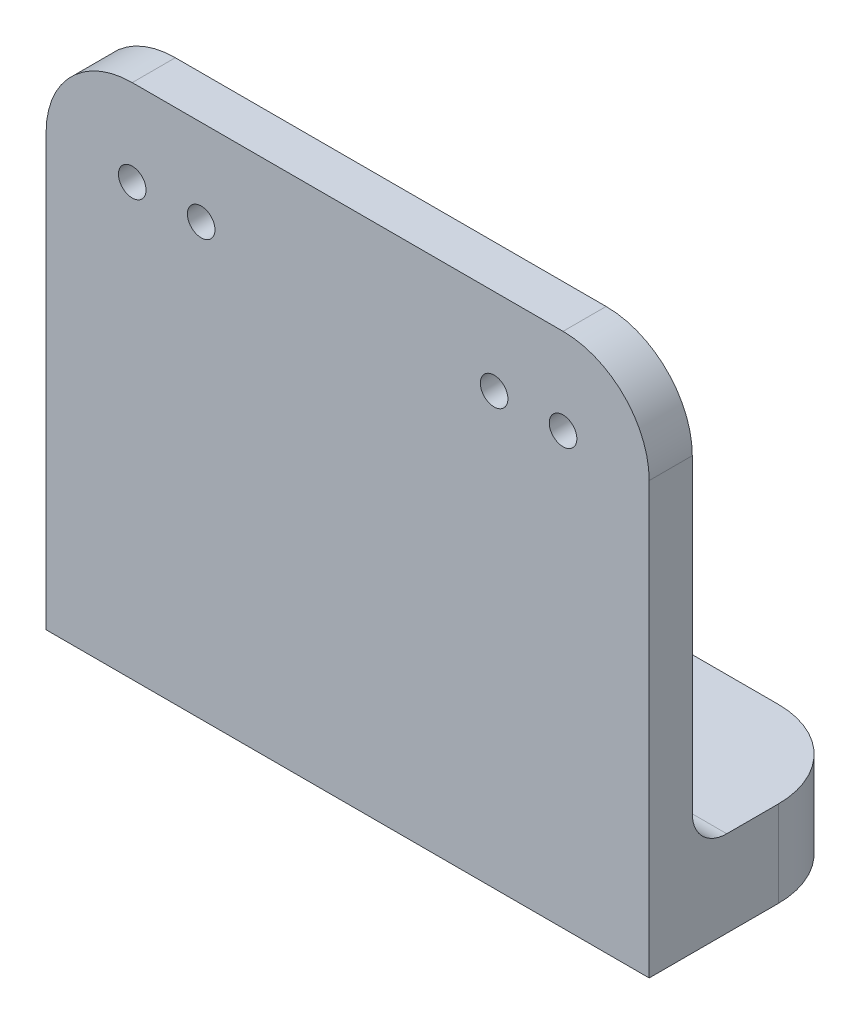
ISO-10303-21;
HEADER;
FILE_DESCRIPTION(('STEP AP214'),'2;1');
FILE_NAME('part.step','',(''),(''),'','','');
FILE_SCHEMA(('AUTOMOTIVE_DESIGN { 1 0 10303 214 1 1 1 1 }'));
ENDSEC;
DATA;
#1=APPLICATION_CONTEXT('core data for automotive mechanical design processes');
#2=APPLICATION_PROTOCOL_DEFINITION('international standard','automotive_design',2000,#1);
#3=PRODUCT_CONTEXT('',#1,'mechanical');
#4=PRODUCT('Part','Part','',(#3));
#5=PRODUCT_RELATED_PRODUCT_CATEGORY('part','',(#4));
#6=PRODUCT_DEFINITION_FORMATION('','',#4);
#7=PRODUCT_DEFINITION_CONTEXT('part definition',#1,'design');
#8=PRODUCT_DEFINITION('design','',#6,#7);
#9=PRODUCT_DEFINITION_SHAPE('','',#8);
#10=(LENGTH_UNIT() NAMED_UNIT(*) SI_UNIT(.MILLI.,.METRE.));
#11=(NAMED_UNIT(*) PLANE_ANGLE_UNIT() SI_UNIT($,.RADIAN.));
#12=(NAMED_UNIT(*) SI_UNIT($,.STERADIAN.) SOLID_ANGLE_UNIT());
#13=UNCERTAINTY_MEASURE_WITH_UNIT(LENGTH_MEASURE(1.E-05),#10,'distance_accuracy_value','');
#14=(GEOMETRIC_REPRESENTATION_CONTEXT(3) GLOBAL_UNCERTAINTY_ASSIGNED_CONTEXT((#13)) GLOBAL_UNIT_ASSIGNED_CONTEXT((#10,
#11,#12)) REPRESENTATION_CONTEXT('',''));
#15=CARTESIAN_POINT('',(0.,0.,0.));
#16=DIRECTION('',(0.,0.,1.));
#17=DIRECTION('',(1.,0.,0.));
#18=AXIS2_PLACEMENT_3D('',#15,#16,#17);
#19=CARTESIAN_POINT('',(20.,10.,-15.));
#20=DIRECTION('',(0.,-1.,0.));
#21=DIRECTION('',(0.,0.,-1.));
#22=AXIS2_PLACEMENT_3D('',#19,#20,#21);
#23=CYLINDRICAL_SURFACE('',#22,1.6);
#24=CARTESIAN_POINT('',(20.,0.,-15.));
#25=DIRECTION('',(0.,1.,0.));
#26=DIRECTION('',(0.,0.,1.));
#27=AXIS2_PLACEMENT_3D('',#24,#25,#26);
#28=CIRCLE('',#27,1.6);
#29=CARTESIAN_POINT('',(20.,0.,-13.4));
#30=VERTEX_POINT('',#29);
#31=EDGE_CURVE('E141',#30,#30,#28,.T.);
#32=ORIENTED_EDGE('',*,*,#31,.F.);
#33=EDGE_LOOP('',(#32));
#34=FACE_BOUND('',#33,.T.);
#35=CARTESIAN_POINT('',(20.,5.,-15.));
#36=DIRECTION('',(0.,1.,0.));
#37=DIRECTION('',(0.,0.,1.));
#38=AXIS2_PLACEMENT_3D('',#35,#36,#37);
#39=CIRCLE('',#38,1.6);
#40=CARTESIAN_POINT('',(20.,5.,-13.4));
#41=VERTEX_POINT('',#40);
#42=EDGE_CURVE('E176',#41,#41,#39,.T.);
#43=ORIENTED_EDGE('',*,*,#42,.T.);
#44=EDGE_LOOP('',(#43));
#45=FACE_BOUND('',#44,.T.);
#46=ADVANCED_FACE('F42',(#34,#45),#23,.F.);
#47=CARTESIAN_POINT('',(50.,10.,-15.));
#48=DIRECTION('',(0.,-1.,0.));
#49=DIRECTION('',(0.,0.,-1.));
#50=AXIS2_PLACEMENT_3D('',#47,#48,#49);
#51=CYLINDRICAL_SURFACE('',#50,1.6);
#52=CARTESIAN_POINT('',(50.,0.,-15.));
#53=DIRECTION('',(0.,1.,0.));
#54=DIRECTION('',(0.,0.,1.));
#55=AXIS2_PLACEMENT_3D('',#52,#53,#54);
#56=CIRCLE('',#55,1.6);
#57=CARTESIAN_POINT('',(50.,0.,-13.4));
#58=VERTEX_POINT('',#57);
#59=EDGE_CURVE('E283',#58,#58,#56,.T.);
#60=ORIENTED_EDGE('',*,*,#59,.F.);
#61=EDGE_LOOP('',(#60));
#62=FACE_BOUND('',#61,.T.);
#63=CARTESIAN_POINT('',(50.,5.,-15.));
#64=DIRECTION('',(0.,1.,0.));
#65=DIRECTION('',(0.,0.,1.));
#66=AXIS2_PLACEMENT_3D('',#63,#64,#65);
#67=CIRCLE('',#66,1.6);
#68=CARTESIAN_POINT('',(50.,5.,-13.4));
#69=VERTEX_POINT('',#68);
#70=EDGE_CURVE('E172',#69,#69,#67,.T.);
#71=ORIENTED_EDGE('',*,*,#70,.T.);
#72=EDGE_LOOP('',(#71));
#73=FACE_BOUND('',#72,.T.);
#74=ADVANCED_FACE('F341',(#62,#73),#51,.F.);
#75=CARTESIAN_POINT('',(0.,10.,0.));
#76=DIRECTION('',(0.,-1.,0.));
#77=DIRECTION('',(0.,0.,-1.));
#78=AXIS2_PLACEMENT_3D('',#75,#76,#77);
#79=PLANE('',#78);
#80=CARTESIAN_POINT('',(20.,10.,-15.));
#81=DIRECTION('',(0.,1.,0.));
#82=DIRECTION('',(0.,0.,1.));
#83=AXIS2_PLACEMENT_3D('',#80,#81,#82);
#84=CIRCLE('',#83,3.5);
#85=CARTESIAN_POINT('',(20.,10.,-11.5));
#86=VERTEX_POINT('',#85);
#87=EDGE_CURVE('E266',#86,#86,#84,.T.);
#88=ORIENTED_EDGE('',*,*,#87,.F.);
#89=EDGE_LOOP('',(#88));
#90=FACE_BOUND('',#89,.T.);
#91=CARTESIAN_POINT('',(50.,10.,-15.));
#92=DIRECTION('',(0.,1.,0.));
#93=DIRECTION('',(0.,0.,1.));
#94=AXIS2_PLACEMENT_3D('',#91,#92,#93);
#95=CIRCLE('',#94,3.50000000000001);
#96=CARTESIAN_POINT('',(50.,10.,-11.5));
#97=VERTEX_POINT('',#96);
#98=EDGE_CURVE('E260',#97,#97,#95,.T.);
#99=ORIENTED_EDGE('',*,*,#98,.F.);
#100=EDGE_LOOP('',(#99));
#101=FACE_BOUND('',#100,.T.);
#102=DIRECTION('',(0.,0.,-1.));
#103=VECTOR('',#102,1.);
#104=CARTESIAN_POINT('',(70.,10.,0.));
#105=LINE('',#104,#103);
#106=CARTESIAN_POINT('',(70.,10.,-9.));
#107=VERTEX_POINT('',#106);
#108=CARTESIAN_POINT('',(70.,10.,-15.));
#109=VERTEX_POINT('',#108);
#110=EDGE_CURVE('E292',#107,#109,#105,.T.);
#111=ORIENTED_EDGE('',*,*,#110,.T.);
#112=CARTESIAN_POINT('',(60.,10.,-15.));
#113=DIRECTION('',(0.,-1.,0.));
#114=DIRECTION('',(0.,0.,-1.));
#115=AXIS2_PLACEMENT_3D('',#112,#113,#114);
#116=CIRCLE('',#115,10.);
#117=CARTESIAN_POINT('',(60.,10.,-25.));
#118=VERTEX_POINT('',#117);
#119=EDGE_CURVE('E11',#109,#118,#116,.F.);
#120=ORIENTED_EDGE('',*,*,#119,.T.);
#121=DIRECTION('',(-1.,0.,0.));
#122=VECTOR('',#121,1.);
#123=CARTESIAN_POINT('',(0.,10.,-25.));
#124=LINE('',#123,#122);
#125=CARTESIAN_POINT('',(10.,10.,-25.));
#126=VERTEX_POINT('',#125);
#127=EDGE_CURVE('E170',#118,#126,#124,.T.);
#128=ORIENTED_EDGE('',*,*,#127,.T.);
#129=CARTESIAN_POINT('',(10.,10.,-15.));
#130=DIRECTION('',(0.,-1.,0.));
#131=DIRECTION('',(0.,0.,-1.));
#132=AXIS2_PLACEMENT_3D('',#129,#130,#131);
#133=CIRCLE('',#132,10.);
#134=CARTESIAN_POINT('',(0.,10.,-15.));
#135=VERTEX_POINT('',#134);
#136=EDGE_CURVE('E52',#126,#135,#133,.F.);
#137=ORIENTED_EDGE('',*,*,#136,.T.);
#138=DIRECTION('',(0.,0.,1.));
#139=VECTOR('',#138,1.);
#140=CARTESIAN_POINT('',(0.,10.,0.));
#141=LINE('',#140,#139);
#142=CARTESIAN_POINT('',(0.,10.,-9.));
#143=VERTEX_POINT('',#142);
#144=EDGE_CURVE('E168',#135,#143,#141,.T.);
#145=ORIENTED_EDGE('',*,*,#144,.T.);
#146=DIRECTION('',(-1.,0.,0.));
#147=VECTOR('',#146,1.);
#148=CARTESIAN_POINT('',(70.,10.,-9.));
#149=LINE('',#148,#147);
#150=EDGE_CURVE('E185',#143,#107,#149,.F.);
#151=ORIENTED_EDGE('',*,*,#150,.T.);
#152=EDGE_LOOP('',(#111,#120,#128,#137,#145,#151));
#153=FACE_BOUND('',#152,.T.);
#154=ADVANCED_FACE('F296',(#90,#101,#153),#79,.F.);
#155=CARTESIAN_POINT('',(0.,0.,0.));
#156=DIRECTION('',(0.,-1.,0.));
#157=DIRECTION('',(0.,0.,-1.));
#158=AXIS2_PLACEMENT_3D('',#155,#156,#157);
#159=PLANE('',#158);
#160=ORIENTED_EDGE('',*,*,#31,.T.);
#161=EDGE_LOOP('',(#160));
#162=FACE_BOUND('',#161,.T.);
#163=DIRECTION('',(-1.,0.,0.));
#164=VECTOR('',#163,1.);
#165=CARTESIAN_POINT('',(0.,0.,-25.));
#166=LINE('',#165,#164);
#167=CARTESIAN_POINT('',(60.,0.,-25.));
#168=VERTEX_POINT('',#167);
#169=CARTESIAN_POINT('',(10.,0.,-25.));
#170=VERTEX_POINT('',#169);
#171=EDGE_CURVE('E162',#168,#170,#166,.T.);
#172=ORIENTED_EDGE('',*,*,#171,.F.);
#173=CARTESIAN_POINT('',(60.,0.,-15.));
#174=DIRECTION('',(0.,-1.,0.));
#175=DIRECTION('',(0.,0.,-1.));
#176=AXIS2_PLACEMENT_3D('',#173,#174,#175);
#177=CIRCLE('',#176,10.);
#178=CARTESIAN_POINT('',(70.,0.,-15.));
#179=VERTEX_POINT('',#178);
#180=EDGE_CURVE('E235',#168,#179,#177,.T.);
#181=ORIENTED_EDGE('',*,*,#180,.T.);
#182=DIRECTION('',(0.,0.,-1.));
#183=VECTOR('',#182,1.);
#184=CARTESIAN_POINT('',(70.,0.,0.));
#185=LINE('',#184,#183);
#186=CARTESIAN_POINT('',(70.,0.,0.));
#187=VERTEX_POINT('',#186);
#188=EDGE_CURVE('E158',#187,#179,#185,.T.);
#189=ORIENTED_EDGE('',*,*,#188,.F.);
#190=DIRECTION('',(1.,0.,0.));
#191=VECTOR('',#190,1.);
#192=CARTESIAN_POINT('',(0.,0.,0.));
#193=LINE('',#192,#191);
#194=CARTESIAN_POINT('',(0.,0.,0.));
#195=VERTEX_POINT('',#194);
#196=EDGE_CURVE('E140',#195,#187,#193,.T.);
#197=ORIENTED_EDGE('',*,*,#196,.F.);
#198=DIRECTION('',(0.,0.,1.));
#199=VECTOR('',#198,1.);
#200=CARTESIAN_POINT('',(0.,0.,0.));
#201=LINE('',#200,#199);
#202=CARTESIAN_POINT('',(0.,0.,-15.));
#203=VERTEX_POINT('',#202);
#204=EDGE_CURVE('E129',#203,#195,#201,.T.);
#205=ORIENTED_EDGE('',*,*,#204,.F.);
#206=CARTESIAN_POINT('',(10.,0.,-15.));
#207=DIRECTION('',(0.,-1.,0.));
#208=DIRECTION('',(0.,0.,-1.));
#209=AXIS2_PLACEMENT_3D('',#206,#207,#208);
#210=CIRCLE('',#209,10.);
#211=EDGE_CURVE('E232',#203,#170,#210,.T.);
#212=ORIENTED_EDGE('',*,*,#211,.T.);
#213=EDGE_LOOP('',(#172,#181,#189,#197,#205,#212));
#214=FACE_BOUND('',#213,.T.);
#215=ORIENTED_EDGE('',*,*,#59,.T.);
#216=EDGE_LOOP('',(#215));
#217=FACE_BOUND('',#216,.T.);
#218=ADVANCED_FACE('F155',(#162,#214,#217),#159,.T.);
#219=CARTESIAN_POINT('',(0.,10.,0.));
#220=DIRECTION('',(1.,0.,0.));
#221=DIRECTION('',(0.,0.,-1.));
#222=AXIS2_PLACEMENT_3D('',#219,#220,#221);
#223=PLANE('',#222);
#224=DIRECTION('',(0.,-1.,0.));
#225=VECTOR('',#224,1.);
#226=CARTESIAN_POINT('',(0.,10.,0.));
#227=LINE('',#226,#225);
#228=CARTESIAN_POINT('',(0.,50.,0.));
#229=VERTEX_POINT('',#228);
#230=EDGE_CURVE('E132',#229,#195,#227,.T.);
#231=ORIENTED_EDGE('',*,*,#230,.F.);
#232=DIRECTION('',(0.,0.,1.));
#233=VECTOR('',#232,1.);
#234=CARTESIAN_POINT('',(0.,50.,0.));
#235=LINE('',#234,#233);
#236=CARTESIAN_POINT('',(0.,50.,-5.));
#237=VERTEX_POINT('',#236);
#238=EDGE_CURVE('E211',#229,#237,#235,.F.);
#239=ORIENTED_EDGE('',*,*,#238,.T.);
#240=DIRECTION('',(0.,-1.,0.));
#241=VECTOR('',#240,1.);
#242=CARTESIAN_POINT('',(0.,60.,-5.));
#243=LINE('',#242,#241);
#244=CARTESIAN_POINT('',(0.,14.,-5.));
#245=VERTEX_POINT('',#244);
#246=EDGE_CURVE('E277',#237,#245,#243,.T.);
#247=ORIENTED_EDGE('',*,*,#246,.T.);
#248=CARTESIAN_POINT('',(0.,14.,-9.));
#249=DIRECTION('',(1.,0.,0.));
#250=DIRECTION('',(0.,0.,-1.));
#251=AXIS2_PLACEMENT_3D('',#248,#249,#250);
#252=CIRCLE('',#251,4.);
#253=EDGE_CURVE('E188',#245,#143,#252,.T.);
#254=ORIENTED_EDGE('',*,*,#253,.T.);
#255=ORIENTED_EDGE('',*,*,#144,.F.);
#256=DIRECTION('',(0.,-1.,0.));
#257=VECTOR('',#256,1.);
#258=CARTESIAN_POINT('',(0.,10.,-15.));
#259=LINE('',#258,#257);
#260=EDGE_CURVE('E136',#135,#203,#259,.T.);
#261=ORIENTED_EDGE('',*,*,#260,.T.);
#262=ORIENTED_EDGE('',*,*,#204,.T.);
#263=EDGE_LOOP('',(#231,#239,#247,#254,#255,#261,#262));
#264=FACE_BOUND('',#263,.T.);
#265=ADVANCED_FACE('F131',(#264),#223,.F.);
#266=CARTESIAN_POINT('',(0.,10.,0.));
#267=DIRECTION('',(0.,0.,-1.));
#268=DIRECTION('',(-1.,0.,0.));
#269=AXIS2_PLACEMENT_3D('',#266,#267,#268);
#270=PLANE('',#269);
#271=CARTESIAN_POINT('',(10.,50.,0.));
#272=DIRECTION('',(0.,0.,1.));
#273=DIRECTION('',(1.,0.,0.));
#274=AXIS2_PLACEMENT_3D('',#271,#272,#273);
#275=CIRCLE('',#274,1.6);
#276=CARTESIAN_POINT('',(11.6,50.,0.));
#277=VERTEX_POINT('',#276);
#278=EDGE_CURVE('E245',#277,#277,#275,.T.);
#279=ORIENTED_EDGE('',*,*,#278,.F.);
#280=EDGE_LOOP('',(#279));
#281=FACE_BOUND('',#280,.T.);
#282=CARTESIAN_POINT('',(18.,50.,0.));
#283=DIRECTION('',(0.,0.,1.));
#284=DIRECTION('',(1.,0.,0.));
#285=AXIS2_PLACEMENT_3D('',#282,#283,#284);
#286=CIRCLE('',#285,1.6);
#287=CARTESIAN_POINT('',(19.6,50.,0.));
#288=VERTEX_POINT('',#287);
#289=EDGE_CURVE('E587',#288,#288,#286,.T.);
#290=ORIENTED_EDGE('',*,*,#289,.F.);
#291=EDGE_LOOP('',(#290));
#292=FACE_BOUND('',#291,.T.);
#293=CARTESIAN_POINT('',(52.,50.,0.));
#294=DIRECTION('',(0.,0.,1.));
#295=DIRECTION('',(-1.,0.,0.));
#296=AXIS2_PLACEMENT_3D('',#293,#294,#295);
#297=CIRCLE('',#296,1.6);
#298=CARTESIAN_POINT('',(50.4,50.,0.));
#299=VERTEX_POINT('',#298);
#300=EDGE_CURVE('E591',#299,#299,#297,.T.);
#301=ORIENTED_EDGE('',*,*,#300,.F.);
#302=EDGE_LOOP('',(#301));
#303=FACE_BOUND('',#302,.T.);
#304=CARTESIAN_POINT('',(60.,50.,0.));
#305=DIRECTION('',(0.,0.,1.));
#306=DIRECTION('',(-1.,0.,0.));
#307=AXIS2_PLACEMENT_3D('',#304,#305,#306);
#308=CIRCLE('',#307,1.6);
#309=CARTESIAN_POINT('',(58.4,50.,0.));
#310=VERTEX_POINT('',#309);
#311=EDGE_CURVE('E597',#310,#310,#308,.T.);
#312=ORIENTED_EDGE('',*,*,#311,.F.);
#313=EDGE_LOOP('',(#312));
#314=FACE_BOUND('',#313,.T.);
#315=DIRECTION('',(1.,0.,0.));
#316=VECTOR('',#315,1.);
#317=CARTESIAN_POINT('',(0.,60.,0.));
#318=LINE('',#317,#316);
#319=CARTESIAN_POINT('',(10.,60.,0.));
#320=VERTEX_POINT('',#319);
#321=CARTESIAN_POINT('',(60.,60.,0.));
#322=VERTEX_POINT('',#321);
#323=EDGE_CURVE('E181',#320,#322,#318,.T.);
#324=ORIENTED_EDGE('',*,*,#323,.F.);
#325=CARTESIAN_POINT('',(10.,50.,0.));
#326=DIRECTION('',(0.,0.,-1.));
#327=DIRECTION('',(-1.,0.,0.));
#328=AXIS2_PLACEMENT_3D('',#325,#326,#327);
#329=CIRCLE('',#328,10.);
#330=EDGE_CURVE('E149',#320,#229,#329,.F.);
#331=ORIENTED_EDGE('',*,*,#330,.T.);
#332=ORIENTED_EDGE('',*,*,#230,.T.);
#333=ORIENTED_EDGE('',*,*,#196,.T.);
#334=DIRECTION('',(0.,-1.,0.));
#335=VECTOR('',#334,1.);
#336=CARTESIAN_POINT('',(70.,10.,0.));
#337=LINE('',#336,#335);
#338=CARTESIAN_POINT('',(70.,50.,0.));
#339=VERTEX_POINT('',#338);
#340=EDGE_CURVE('E152',#339,#187,#337,.T.);
#341=ORIENTED_EDGE('',*,*,#340,.F.);
#342=CARTESIAN_POINT('',(60.,50.,0.));
#343=DIRECTION('',(0.,0.,-1.));
#344=DIRECTION('',(-1.,0.,0.));
#345=AXIS2_PLACEMENT_3D('',#342,#343,#344);
#346=CIRCLE('',#345,10.);
#347=EDGE_CURVE('E204',#339,#322,#346,.F.);
#348=ORIENTED_EDGE('',*,*,#347,.T.);
#349=EDGE_LOOP('',(#324,#331,#332,#333,#341,#348));
#350=FACE_BOUND('',#349,.T.);
#351=ADVANCED_FACE('F146',(#281,#292,#303,#314,#350),#270,.F.);
#352=CARTESIAN_POINT('',(70.,10.,0.));
#353=DIRECTION('',(-1.,0.,0.));
#354=DIRECTION('',(0.,0.,1.));
#355=AXIS2_PLACEMENT_3D('',#352,#353,#354);
#356=PLANE('',#355);
#357=DIRECTION('',(0.,-1.,0.));
#358=VECTOR('',#357,1.);
#359=CARTESIAN_POINT('',(70.,60.,-5.));
#360=LINE('',#359,#358);
#361=CARTESIAN_POINT('',(70.,50.,-5.));
#362=VERTEX_POINT('',#361);
#363=CARTESIAN_POINT('',(70.,14.,-5.));
#364=VERTEX_POINT('',#363);
#365=EDGE_CURVE('E280',#362,#364,#360,.T.);
#366=ORIENTED_EDGE('',*,*,#365,.F.);
#367=DIRECTION('',(0.,0.,-1.));
#368=VECTOR('',#367,1.);
#369=CARTESIAN_POINT('',(70.,50.,0.));
#370=LINE('',#369,#368);
#371=EDGE_CURVE('E223',#362,#339,#370,.F.);
#372=ORIENTED_EDGE('',*,*,#371,.T.);
#373=ORIENTED_EDGE('',*,*,#340,.T.);
#374=ORIENTED_EDGE('',*,*,#188,.T.);
#375=DIRECTION('',(0.,-1.,0.));
#376=VECTOR('',#375,1.);
#377=CARTESIAN_POINT('',(70.,10.,-15.));
#378=LINE('',#377,#376);
#379=EDGE_CURVE('E220',#179,#109,#378,.F.);
#380=ORIENTED_EDGE('',*,*,#379,.T.);
#381=ORIENTED_EDGE('',*,*,#110,.F.);
#382=CARTESIAN_POINT('',(70.,14.,-9.));
#383=DIRECTION('',(-1.,0.,0.));
#384=DIRECTION('',(0.,0.,1.));
#385=AXIS2_PLACEMENT_3D('',#382,#383,#384);
#386=CIRCLE('',#385,4.);
#387=EDGE_CURVE('E192',#107,#364,#386,.T.);
#388=ORIENTED_EDGE('',*,*,#387,.T.);
#389=EDGE_LOOP('',(#366,#372,#373,#374,#380,#381,#388));
#390=FACE_BOUND('',#389,.T.);
#391=ADVANCED_FACE('F305',(#390),#356,.F.);
#392=CARTESIAN_POINT('',(0.,10.,-25.));
#393=DIRECTION('',(0.,0.,1.));
#394=DIRECTION('',(1.,0.,0.));
#395=AXIS2_PLACEMENT_3D('',#392,#393,#394);
#396=PLANE('',#395);
#397=ORIENTED_EDGE('',*,*,#127,.F.);
#398=DIRECTION('',(0.,-1.,0.));
#399=VECTOR('',#398,1.);
#400=CARTESIAN_POINT('',(60.,10.,-25.));
#401=LINE('',#400,#399);
#402=EDGE_CURVE('E228',#118,#168,#401,.T.);
#403=ORIENTED_EDGE('',*,*,#402,.T.);
#404=ORIENTED_EDGE('',*,*,#171,.T.);
#405=DIRECTION('',(0.,-1.,0.));
#406=VECTOR('',#405,1.);
#407=CARTESIAN_POINT('',(10.,10.,-25.));
#408=LINE('',#407,#406);
#409=EDGE_CURVE('E60',#170,#126,#408,.F.);
#410=ORIENTED_EDGE('',*,*,#409,.T.);
#411=EDGE_LOOP('',(#397,#403,#404,#410));
#412=FACE_BOUND('',#411,.T.);
#413=ADVANCED_FACE('F299',(#412),#396,.F.);
#414=CARTESIAN_POINT('',(0.,60.,-5.));
#415=DIRECTION('',(0.,0.,1.));
#416=DIRECTION('',(1.,0.,0.));
#417=AXIS2_PLACEMENT_3D('',#414,#415,#416);
#418=PLANE('',#417);
#419=CARTESIAN_POINT('',(10.,50.,-5.));
#420=DIRECTION('',(0.,0.,1.));
#421=DIRECTION('',(1.,0.,0.));
#422=AXIS2_PLACEMENT_3D('',#419,#420,#421);
#423=CIRCLE('',#422,1.6);
#424=CARTESIAN_POINT('',(11.6,50.,-5.));
#425=VERTEX_POINT('',#424);
#426=EDGE_CURVE('E46',#425,#425,#423,.T.);
#427=ORIENTED_EDGE('',*,*,#426,.T.);
#428=EDGE_LOOP('',(#427));
#429=FACE_BOUND('',#428,.T.);
#430=CARTESIAN_POINT('',(18.,50.,-5.));
#431=DIRECTION('',(0.,0.,1.));
#432=DIRECTION('',(1.,0.,0.));
#433=AXIS2_PLACEMENT_3D('',#430,#431,#432);
#434=CIRCLE('',#433,1.6);
#435=CARTESIAN_POINT('',(19.6,50.,-5.));
#436=VERTEX_POINT('',#435);
#437=EDGE_CURVE('E248',#436,#436,#434,.T.);
#438=ORIENTED_EDGE('',*,*,#437,.T.);
#439=EDGE_LOOP('',(#438));
#440=FACE_BOUND('',#439,.T.);
#441=CARTESIAN_POINT('',(52.,50.,-5.));
#442=DIRECTION('',(0.,0.,1.));
#443=DIRECTION('',(1.,0.,0.));
#444=AXIS2_PLACEMENT_3D('',#441,#442,#443);
#445=CIRCLE('',#444,1.6);
#446=CARTESIAN_POINT('',(53.6,50.,-5.));
#447=VERTEX_POINT('',#446);
#448=EDGE_CURVE('E244',#447,#447,#445,.T.);
#449=ORIENTED_EDGE('',*,*,#448,.T.);
#450=EDGE_LOOP('',(#449));
#451=FACE_BOUND('',#450,.T.);
#452=CARTESIAN_POINT('',(60.,50.,-5.));
#453=DIRECTION('',(0.,0.,1.));
#454=DIRECTION('',(1.,0.,0.));
#455=AXIS2_PLACEMENT_3D('',#452,#453,#454);
#456=CIRCLE('',#455,1.6);
#457=CARTESIAN_POINT('',(61.6,50.,-5.));
#458=VERTEX_POINT('',#457);
#459=EDGE_CURVE('E240',#458,#458,#456,.T.);
#460=ORIENTED_EDGE('',*,*,#459,.T.);
#461=EDGE_LOOP('',(#460));
#462=FACE_BOUND('',#461,.T.);
#463=ORIENTED_EDGE('',*,*,#246,.F.);
#464=CARTESIAN_POINT('',(10.,50.,-5.));
#465=DIRECTION('',(0.,0.,1.));
#466=DIRECTION('',(1.,0.,0.));
#467=AXIS2_PLACEMENT_3D('',#464,#465,#466);
#468=CIRCLE('',#467,10.);
#469=CARTESIAN_POINT('',(10.,60.,-5.));
#470=VERTEX_POINT('',#469);
#471=EDGE_CURVE('E217',#237,#470,#468,.F.);
#472=ORIENTED_EDGE('',*,*,#471,.T.);
#473=DIRECTION('',(-1.,0.,0.));
#474=VECTOR('',#473,1.);
#475=CARTESIAN_POINT('',(0.,60.,-5.));
#476=LINE('',#475,#474);
#477=CARTESIAN_POINT('',(60.,60.,-5.));
#478=VERTEX_POINT('',#477);
#479=EDGE_CURVE('E273',#478,#470,#476,.T.);
#480=ORIENTED_EDGE('',*,*,#479,.F.);
#481=CARTESIAN_POINT('',(60.,50.,-5.));
#482=DIRECTION('',(0.,0.,1.));
#483=DIRECTION('',(1.,0.,0.));
#484=AXIS2_PLACEMENT_3D('',#481,#482,#483);
#485=CIRCLE('',#484,10.);
#486=EDGE_CURVE('E214',#478,#362,#485,.F.);
#487=ORIENTED_EDGE('',*,*,#486,.T.);
#488=ORIENTED_EDGE('',*,*,#365,.T.);
#489=DIRECTION('',(-1.,0.,0.));
#490=VECTOR('',#489,1.);
#491=CARTESIAN_POINT('',(0.,14.,-5.));
#492=LINE('',#491,#490);
#493=EDGE_CURVE('E151',#364,#245,#492,.T.);
#494=ORIENTED_EDGE('',*,*,#493,.T.);
#495=EDGE_LOOP('',(#463,#472,#480,#487,#488,#494));
#496=FACE_BOUND('',#495,.T.);
#497=ADVANCED_FACE('F318',(#429,#440,#451,#462,#496),#418,.F.);
#498=CARTESIAN_POINT('',(0.,60.,0.));
#499=DIRECTION('',(0.,-1.,0.));
#500=DIRECTION('',(0.,0.,-1.));
#501=AXIS2_PLACEMENT_3D('',#498,#499,#500);
#502=PLANE('',#501);
#503=ORIENTED_EDGE('',*,*,#479,.T.);
#504=DIRECTION('',(0.,0.,1.));
#505=VECTOR('',#504,1.);
#506=CARTESIAN_POINT('',(10.,60.,0.));
#507=LINE('',#506,#505);
#508=EDGE_CURVE('E200',#470,#320,#507,.T.);
#509=ORIENTED_EDGE('',*,*,#508,.T.);
#510=ORIENTED_EDGE('',*,*,#323,.T.);
#511=DIRECTION('',(0.,0.,-1.));
#512=VECTOR('',#511,1.);
#513=CARTESIAN_POINT('',(60.,60.,0.));
#514=LINE('',#513,#512);
#515=EDGE_CURVE('E196',#322,#478,#514,.T.);
#516=ORIENTED_EDGE('',*,*,#515,.T.);
#517=EDGE_LOOP('',(#503,#509,#510,#516));
#518=FACE_BOUND('',#517,.T.);
#519=ADVANCED_FACE('F314',(#518),#502,.F.);
#520=CARTESIAN_POINT('',(50.,5.,-15.));
#521=DIRECTION('',(0.,1.,0.));
#522=DIRECTION('',(0.,0.,1.));
#523=AXIS2_PLACEMENT_3D('',#520,#521,#522);
#524=CYLINDRICAL_SURFACE('',#523,3.50000000000001);
#525=CARTESIAN_POINT('',(50.,5.,-15.));
#526=DIRECTION('',(0.,1.,0.));
#527=DIRECTION('',(0.,0.,1.));
#528=AXIS2_PLACEMENT_3D('',#525,#526,#527);
#529=CIRCLE('',#528,3.50000000000001);
#530=CARTESIAN_POINT('',(50.,5.,-11.5));
#531=VERTEX_POINT('',#530);
#532=EDGE_CURVE('E255',#531,#531,#529,.T.);
#533=ORIENTED_EDGE('',*,*,#532,.F.);
#534=EDGE_LOOP('',(#533));
#535=FACE_BOUND('',#534,.T.);
#536=ORIENTED_EDGE('',*,*,#98,.T.);
#537=EDGE_LOOP('',(#536));
#538=FACE_BOUND('',#537,.T.);
#539=ADVANCED_FACE('F402',(#535,#538),#524,.F.);
#540=CARTESIAN_POINT('',(50.,5.,-15.));
#541=DIRECTION('',(0.,1.,0.));
#542=DIRECTION('',(0.,0.,1.));
#543=AXIS2_PLACEMENT_3D('',#540,#541,#542);
#544=PLANE('',#543);
#545=ORIENTED_EDGE('',*,*,#70,.F.);
#546=EDGE_LOOP('',(#545));
#547=FACE_BOUND('',#546,.T.);
#548=ORIENTED_EDGE('',*,*,#532,.T.);
#549=EDGE_LOOP('',(#548));
#550=FACE_BOUND('',#549,.T.);
#551=ADVANCED_FACE('F409',(#547,#550),#544,.T.);
#552=CARTESIAN_POINT('',(20.,5.,-15.));
#553=DIRECTION('',(0.,1.,0.));
#554=DIRECTION('',(0.,0.,1.));
#555=AXIS2_PLACEMENT_3D('',#552,#553,#554);
#556=CYLINDRICAL_SURFACE('',#555,3.5);
#557=CARTESIAN_POINT('',(20.,5.,-15.));
#558=DIRECTION('',(0.,1.,0.));
#559=DIRECTION('',(0.,0.,1.));
#560=AXIS2_PLACEMENT_3D('',#557,#558,#559);
#561=CIRCLE('',#560,3.5);
#562=CARTESIAN_POINT('',(20.,5.,-11.5));
#563=VERTEX_POINT('',#562);
#564=EDGE_CURVE('E177',#563,#563,#561,.T.);
#565=ORIENTED_EDGE('',*,*,#564,.F.);
#566=EDGE_LOOP('',(#565));
#567=FACE_BOUND('',#566,.T.);
#568=ORIENTED_EDGE('',*,*,#87,.T.);
#569=EDGE_LOOP('',(#568));
#570=FACE_BOUND('',#569,.T.);
#571=ADVANCED_FACE('F336',(#567,#570),#556,.F.);
#572=CARTESIAN_POINT('',(20.,5.,-15.));
#573=DIRECTION('',(0.,1.,0.));
#574=DIRECTION('',(0.,0.,1.));
#575=AXIS2_PLACEMENT_3D('',#572,#573,#574);
#576=PLANE('',#575);
#577=ORIENTED_EDGE('',*,*,#42,.F.);
#578=EDGE_LOOP('',(#577));
#579=FACE_BOUND('',#578,.T.);
#580=ORIENTED_EDGE('',*,*,#564,.T.);
#581=EDGE_LOOP('',(#580));
#582=FACE_BOUND('',#581,.T.);
#583=ADVANCED_FACE('F329',(#579,#582),#576,.T.);
#584=CARTESIAN_POINT('',(0.,14.,-9.));
#585=DIRECTION('',(1.,0.,0.));
#586=DIRECTION('',(0.,0.,-1.));
#587=AXIS2_PLACEMENT_3D('',#584,#585,#586);
#588=CYLINDRICAL_SURFACE('',#587,4.);
#589=ORIENTED_EDGE('',*,*,#387,.F.);
#590=ORIENTED_EDGE('',*,*,#150,.F.);
#591=ORIENTED_EDGE('',*,*,#253,.F.);
#592=ORIENTED_EDGE('',*,*,#493,.F.);
#593=EDGE_LOOP('',(#589,#590,#591,#592));
#594=FACE_BOUND('',#593,.T.);
#595=ADVANCED_FACE('F327',(#594),#588,.F.);
#596=CARTESIAN_POINT('',(10.,50.,0.));
#597=DIRECTION('',(0.,0.,1.));
#598=DIRECTION('',(1.,0.,0.));
#599=AXIS2_PLACEMENT_3D('',#596,#597,#598);
#600=CYLINDRICAL_SURFACE('',#599,10.);
#601=ORIENTED_EDGE('',*,*,#471,.F.);
#602=ORIENTED_EDGE('',*,*,#238,.F.);
#603=ORIENTED_EDGE('',*,*,#330,.F.);
#604=ORIENTED_EDGE('',*,*,#508,.F.);
#605=EDGE_LOOP('',(#601,#602,#603,#604));
#606=FACE_BOUND('',#605,.T.);
#607=ADVANCED_FACE('F321',(#606),#600,.T.);
#608=CARTESIAN_POINT('',(60.,50.,0.));
#609=DIRECTION('',(0.,0.,-1.));
#610=DIRECTION('',(-1.,0.,0.));
#611=AXIS2_PLACEMENT_3D('',#608,#609,#610);
#612=CYLINDRICAL_SURFACE('',#611,10.);
#613=ORIENTED_EDGE('',*,*,#347,.F.);
#614=ORIENTED_EDGE('',*,*,#371,.F.);
#615=ORIENTED_EDGE('',*,*,#486,.F.);
#616=ORIENTED_EDGE('',*,*,#515,.F.);
#617=EDGE_LOOP('',(#613,#614,#615,#616));
#618=FACE_BOUND('',#617,.T.);
#619=ADVANCED_FACE('F311',(#618),#612,.T.);
#620=CARTESIAN_POINT('',(60.,10.,-15.));
#621=DIRECTION('',(0.,-1.,0.));
#622=DIRECTION('',(0.,0.,-1.));
#623=AXIS2_PLACEMENT_3D('',#620,#621,#622);
#624=CYLINDRICAL_SURFACE('',#623,10.);
#625=ORIENTED_EDGE('',*,*,#119,.F.);
#626=ORIENTED_EDGE('',*,*,#379,.F.);
#627=ORIENTED_EDGE('',*,*,#180,.F.);
#628=ORIENTED_EDGE('',*,*,#402,.F.);
#629=EDGE_LOOP('',(#625,#626,#627,#628));
#630=FACE_BOUND('',#629,.T.);
#631=ADVANCED_FACE('F301',(#630),#624,.T.);
#632=CARTESIAN_POINT('',(10.,10.,-15.));
#633=DIRECTION('',(0.,-1.,0.));
#634=DIRECTION('',(0.,0.,-1.));
#635=AXIS2_PLACEMENT_3D('',#632,#633,#634);
#636=CYLINDRICAL_SURFACE('',#635,10.);
#637=ORIENTED_EDGE('',*,*,#136,.F.);
#638=ORIENTED_EDGE('',*,*,#409,.F.);
#639=ORIENTED_EDGE('',*,*,#211,.F.);
#640=ORIENTED_EDGE('',*,*,#260,.F.);
#641=EDGE_LOOP('',(#637,#638,#639,#640));
#642=FACE_BOUND('',#641,.T.);
#643=ADVANCED_FACE('F44',(#642),#636,.T.);
#644=CARTESIAN_POINT('',(60.,50.,-25.));
#645=DIRECTION('',(0.,0.,1.));
#646=DIRECTION('',(1.,0.,0.));
#647=AXIS2_PLACEMENT_3D('',#644,#645,#646);
#648=CYLINDRICAL_SURFACE('',#647,1.6);
#649=ORIENTED_EDGE('',*,*,#311,.T.);
#650=EDGE_LOOP('',(#649));
#651=FACE_BOUND('',#650,.T.);
#652=ORIENTED_EDGE('',*,*,#459,.F.);
#653=EDGE_LOOP('',(#652));
#654=FACE_BOUND('',#653,.T.);
#655=ADVANCED_FACE('F527',(#651,#654),#648,.F.);
#656=CARTESIAN_POINT('',(52.,50.,-25.));
#657=DIRECTION('',(0.,0.,1.));
#658=DIRECTION('',(1.,0.,0.));
#659=AXIS2_PLACEMENT_3D('',#656,#657,#658);
#660=CYLINDRICAL_SURFACE('',#659,1.6);
#661=ORIENTED_EDGE('',*,*,#300,.T.);
#662=EDGE_LOOP('',(#661));
#663=FACE_BOUND('',#662,.T.);
#664=ORIENTED_EDGE('',*,*,#448,.F.);
#665=EDGE_LOOP('',(#664));
#666=FACE_BOUND('',#665,.T.);
#667=ADVANCED_FACE('F534',(#663,#666),#660,.F.);
#668=CARTESIAN_POINT('',(18.,50.,-25.));
#669=DIRECTION('',(0.,0.,1.));
#670=DIRECTION('',(1.,0.,0.));
#671=AXIS2_PLACEMENT_3D('',#668,#669,#670);
#672=CYLINDRICAL_SURFACE('',#671,1.6);
#673=ORIENTED_EDGE('',*,*,#289,.T.);
#674=EDGE_LOOP('',(#673));
#675=FACE_BOUND('',#674,.T.);
#676=ORIENTED_EDGE('',*,*,#437,.F.);
#677=EDGE_LOOP('',(#676));
#678=FACE_BOUND('',#677,.T.);
#679=ADVANCED_FACE('F543',(#675,#678),#672,.F.);
#680=CARTESIAN_POINT('',(10.,50.,-25.));
#681=DIRECTION('',(0.,0.,1.));
#682=DIRECTION('',(1.,0.,0.));
#683=AXIS2_PLACEMENT_3D('',#680,#681,#682);
#684=CYLINDRICAL_SURFACE('',#683,1.6);
#685=ORIENTED_EDGE('',*,*,#278,.T.);
#686=EDGE_LOOP('',(#685));
#687=FACE_BOUND('',#686,.T.);
#688=ORIENTED_EDGE('',*,*,#426,.F.);
#689=EDGE_LOOP('',(#688));
#690=FACE_BOUND('',#689,.T.);
#691=ADVANCED_FACE('F553',(#687,#690),#684,.F.);
#692=CLOSED_SHELL('',(#46,#74,#154,#218,#265,#351,#391,#413,#497,#519,#539,#551,#571,#583,#595,
#607,#619,#631,#643,#655,#667,#679,#691));
#693=MANIFOLD_SOLID_BREP('B2',#692);
#694=ADVANCED_BREP_SHAPE_REPRESENTATION('',(#18,#693),#14);
#695=SHAPE_DEFINITION_REPRESENTATION(#9,#694);
ENDSEC;
END-ISO-10303-21;
